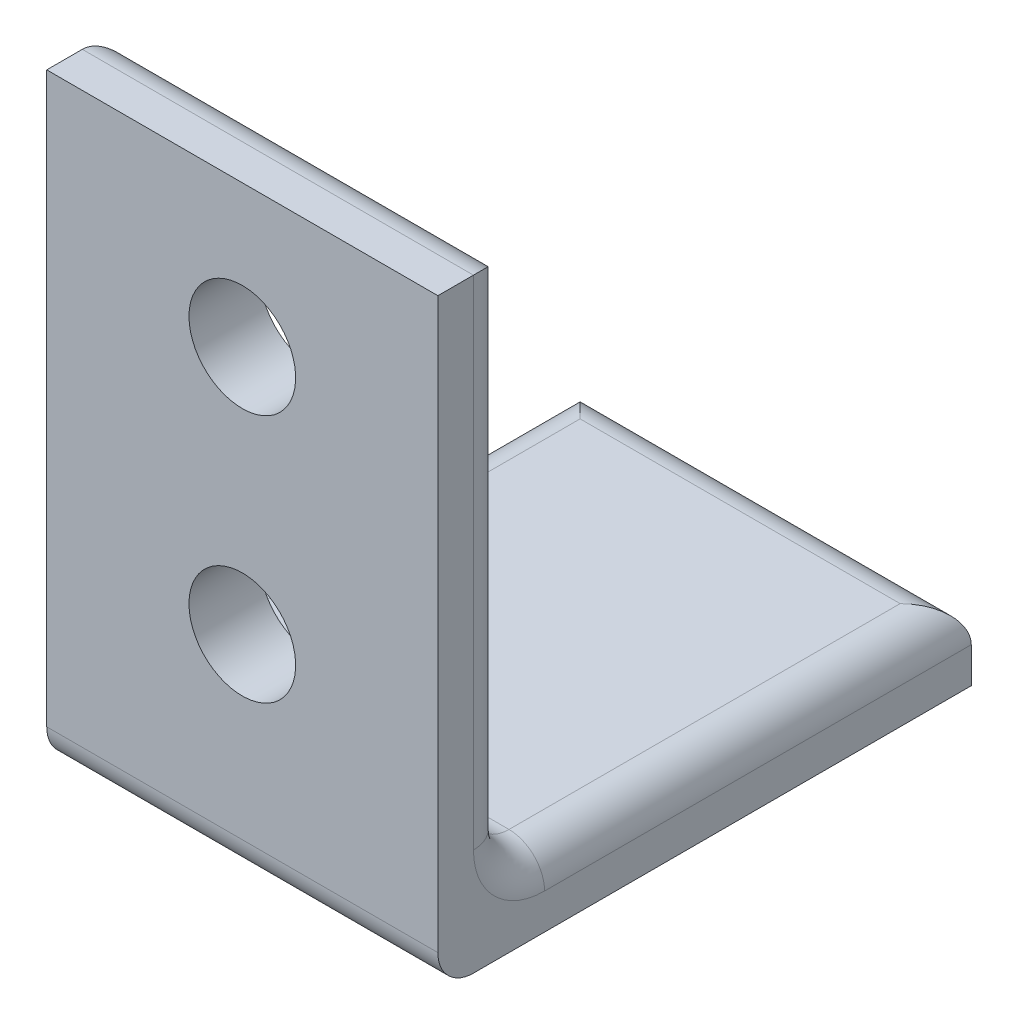
ISO-10303-21;
HEADER;
FILE_DESCRIPTION(('STEP AP214'),'2;1');
FILE_NAME('part.step','',(''),(''),'','','');
FILE_SCHEMA(('AUTOMOTIVE_DESIGN { 1 0 10303 214 1 1 1 1 }'));
ENDSEC;
DATA;
#1=APPLICATION_CONTEXT('core data for automotive mechanical design processes');
#2=APPLICATION_PROTOCOL_DEFINITION('international standard','automotive_design',2000,#1);
#3=PRODUCT_CONTEXT('',#1,'mechanical');
#4=PRODUCT('Part','Part','',(#3));
#5=PRODUCT_RELATED_PRODUCT_CATEGORY('part','',(#4));
#6=PRODUCT_DEFINITION_FORMATION('','',#4);
#7=PRODUCT_DEFINITION_CONTEXT('part definition',#1,'design');
#8=PRODUCT_DEFINITION('design','',#6,#7);
#9=PRODUCT_DEFINITION_SHAPE('','',#8);
#10=(LENGTH_UNIT() NAMED_UNIT(*) SI_UNIT(.MILLI.,.METRE.));
#11=(NAMED_UNIT(*) PLANE_ANGLE_UNIT() SI_UNIT($,.RADIAN.));
#12=(NAMED_UNIT(*) SI_UNIT($,.STERADIAN.) SOLID_ANGLE_UNIT());
#13=UNCERTAINTY_MEASURE_WITH_UNIT(LENGTH_MEASURE(1.E-05),#10,'distance_accuracy_value','');
#14=(GEOMETRIC_REPRESENTATION_CONTEXT(3) GLOBAL_UNCERTAINTY_ASSIGNED_CONTEXT((#13)) GLOBAL_UNIT_ASSIGNED_CONTEXT((#10,
#11,#12)) REPRESENTATION_CONTEXT('',''));
#15=CARTESIAN_POINT('',(0.,0.,0.));
#16=DIRECTION('',(0.,0.,1.));
#17=DIRECTION('',(1.,0.,0.));
#18=AXIS2_PLACEMENT_3D('',#15,#16,#17);
#19=CARTESIAN_POINT('',(0.,2.,0.));
#20=DIRECTION('',(0.,-1.,0.));
#21=DIRECTION('',(0.,0.,-1.));
#22=AXIS2_PLACEMENT_3D('',#19,#20,#21);
#23=PLANE('',#22);
#24=DIRECTION('',(-1.,0.,0.));
#25=VECTOR('',#24,1.);
#26=CARTESIAN_POINT('',(-20.4424150508756,2.,23.6245786874606));
#27=LINE('',#26,#25);
#28=CARTESIAN_POINT('',(-30.4424150508756,2.,23.6245786874606));
#29=VERTEX_POINT('',#28);
#30=CARTESIAN_POINT('',(-21.4424150508756,2.,23.6245786874606));
#31=VERTEX_POINT('',#30);
#32=EDGE_CURVE('E172',#29,#31,#27,.F.);
#33=ORIENTED_EDGE('',*,*,#32,.T.);
#34=DIRECTION('',(0.,0.,-1.));
#35=VECTOR('',#34,1.);
#36=CARTESIAN_POINT('',(-21.4424150508756,2.,0.));
#37=LINE('',#36,#35);
#38=CARTESIAN_POINT('',(-21.4424150508756,2.,12.6245786874606));
#39=VERTEX_POINT('',#38);
#40=EDGE_CURVE('E43',#31,#39,#37,.T.);
#41=ORIENTED_EDGE('',*,*,#40,.T.);
#42=DIRECTION('',(1.,0.,0.));
#43=VECTOR('',#42,1.);
#44=CARTESIAN_POINT('',(0.,2.,12.6245786874606));
#45=LINE('',#44,#43);
#46=CARTESIAN_POINT('',(-30.4424150508756,2.,12.6245786874606));
#47=VERTEX_POINT('',#46);
#48=EDGE_CURVE('E54',#39,#47,#45,.F.);
#49=ORIENTED_EDGE('',*,*,#48,.T.);
#50=DIRECTION('',(0.,0.,1.));
#51=VECTOR('',#50,1.);
#52=CARTESIAN_POINT('',(-30.4424150508756,2.,0.));
#53=LINE('',#52,#51);
#54=EDGE_CURVE('E199',#47,#29,#53,.T.);
#55=ORIENTED_EDGE('',*,*,#54,.T.);
#56=EDGE_LOOP('',(#33,#41,#49,#55));
#57=FACE_BOUND('',#56,.T.);
#58=ADVANCED_FACE('F34',(#57),#23,.F.);
#59=CARTESIAN_POINT('',(-31.4424150508756,2.,26.6245786874606));
#60=DIRECTION('',(1.,0.,0.));
#61=DIRECTION('',(0.,0.,-1.));
#62=AXIS2_PLACEMENT_3D('',#59,#60,#61);
#63=PLANE('',#62);
#64=DIRECTION('',(0.,0.,1.));
#65=VECTOR('',#64,1.);
#66=CARTESIAN_POINT('',(-31.4424150508756,17.,26.6245786874606));
#67=LINE('',#66,#65);
#68=CARTESIAN_POINT('',(-31.4424150508756,17.,25.6245786874606));
#69=VERTEX_POINT('',#68);
#70=CARTESIAN_POINT('',(-31.4424150508756,17.,26.6245786874606));
#71=VERTEX_POINT('',#70);
#72=EDGE_CURVE('E250',#69,#71,#67,.T.);
#73=ORIENTED_EDGE('',*,*,#72,.F.);
#74=DIRECTION('',(0.,-1.,0.));
#75=VECTOR('',#74,1.);
#76=CARTESIAN_POINT('',(-31.4424150508756,2.,25.6245786874606));
#77=LINE('',#76,#75);
#78=CARTESIAN_POINT('',(-31.4424150508756,3.,25.6245786874606));
#79=VERTEX_POINT('',#78);
#80=EDGE_CURVE('E195',#69,#79,#77,.T.);
#81=ORIENTED_EDGE('',*,*,#80,.T.);
#82=CARTESIAN_POINT('',(-31.4424150508756,3.,23.6245786874606));
#83=DIRECTION('',(1.,0.,0.));
#84=DIRECTION('',(0.,0.,-1.));
#85=AXIS2_PLACEMENT_3D('',#82,#83,#84);
#86=CIRCLE('',#85,2.);
#87=CARTESIAN_POINT('',(-31.4424150508756,1.,23.6245786874606));
#88=VERTEX_POINT('',#87);
#89=EDGE_CURVE('E193',#79,#88,#86,.T.);
#90=ORIENTED_EDGE('',*,*,#89,.T.);
#91=DIRECTION('',(0.,0.,1.));
#92=VECTOR('',#91,1.);
#93=CARTESIAN_POINT('',(-31.4424150508756,1.,26.6245786874606));
#94=LINE('',#93,#92);
#95=CARTESIAN_POINT('',(-31.4424150508756,0.999999999999999,11.6245786874606));
#96=VERTEX_POINT('',#95);
#97=EDGE_CURVE('E143',#88,#96,#94,.F.);
#98=ORIENTED_EDGE('',*,*,#97,.T.);
#99=DIRECTION('',(0.,1.,0.));
#100=VECTOR('',#99,1.);
#101=CARTESIAN_POINT('',(-31.4424150508756,-13.,11.6245786874606));
#102=LINE('',#101,#100);
#103=CARTESIAN_POINT('',(-31.4424150508756,0.,11.6245786874606));
#104=VERTEX_POINT('',#103);
#105=EDGE_CURVE('E126',#104,#96,#102,.T.);
#106=ORIENTED_EDGE('',*,*,#105,.F.);
#107=DIRECTION('',(0.,0.,1.));
#108=VECTOR('',#107,1.);
#109=CARTESIAN_POINT('',(-31.4424150508756,0.,26.6245786874606));
#110=LINE('',#109,#108);
#111=CARTESIAN_POINT('',(-31.4424150508756,0.,25.6245786874606));
#112=VERTEX_POINT('',#111);
#113=EDGE_CURVE('E140',#104,#112,#110,.T.);
#114=ORIENTED_EDGE('',*,*,#113,.T.);
#115=CARTESIAN_POINT('',(-31.4424150508756,1.,25.6245786874606));
#116=DIRECTION('',(1.,0.,0.));
#117=DIRECTION('',(0.,0.,-1.));
#118=AXIS2_PLACEMENT_3D('',#115,#116,#117);
#119=CIRCLE('',#118,1.);
#120=CARTESIAN_POINT('',(-31.4424150508756,1.,26.6245786874606));
#121=VERTEX_POINT('',#120);
#122=EDGE_CURVE('E167',#112,#121,#119,.F.);
#123=ORIENTED_EDGE('',*,*,#122,.T.);
#124=DIRECTION('',(0.,-1.,0.));
#125=VECTOR('',#124,1.);
#126=CARTESIAN_POINT('',(-31.4424150508756,2.,26.6245786874606));
#127=LINE('',#126,#125);
#128=EDGE_CURVE('E134',#71,#121,#127,.T.);
#129=ORIENTED_EDGE('',*,*,#128,.F.);
#130=EDGE_LOOP('',(#73,#81,#90,#98,#106,#114,#123,#129));
#131=FACE_BOUND('',#130,.T.);
#132=ADVANCED_FACE('F139',(#131),#63,.F.);
#133=CARTESIAN_POINT('',(-31.4424150508756,2.,26.6245786874606));
#134=DIRECTION('',(0.,0.,-1.));
#135=DIRECTION('',(-1.,0.,0.));
#136=AXIS2_PLACEMENT_3D('',#133,#134,#135);
#137=PLANE('',#136);
#138=CARTESIAN_POINT('',(-25.9424150508756,13.,26.6245786874606));
#139=DIRECTION('',(0.,0.,-1.));
#140=DIRECTION('',(-1.,0.,0.));
#141=AXIS2_PLACEMENT_3D('',#138,#139,#140);
#142=CIRCLE('',#141,1.5);
#143=CARTESIAN_POINT('',(-27.4424150508756,13.,26.6245786874606));
#144=VERTEX_POINT('',#143);
#145=EDGE_CURVE('E239',#144,#144,#142,.T.);
#146=ORIENTED_EDGE('',*,*,#145,.T.);
#147=EDGE_LOOP('',(#146));
#148=FACE_BOUND('',#147,.T.);
#149=CARTESIAN_POINT('',(-25.9424150508756,6.,26.6245786874606));
#150=DIRECTION('',(0.,0.,-1.));
#151=DIRECTION('',(-1.,0.,0.));
#152=AXIS2_PLACEMENT_3D('',#149,#150,#151);
#153=CIRCLE('',#152,1.5);
#154=CARTESIAN_POINT('',(-27.4424150508756,6.,26.6245786874606));
#155=VERTEX_POINT('',#154);
#156=EDGE_CURVE('E247',#155,#155,#153,.T.);
#157=ORIENTED_EDGE('',*,*,#156,.T.);
#158=EDGE_LOOP('',(#157));
#159=FACE_BOUND('',#158,.T.);
#160=ORIENTED_EDGE('',*,*,#128,.T.);
#161=DIRECTION('',(1.,0.,0.));
#162=VECTOR('',#161,1.);
#163=CARTESIAN_POINT('',(-20.4424150508756,1.,26.6245786874606));
#164=LINE('',#163,#162);
#165=CARTESIAN_POINT('',(-20.4424150508756,1.,26.6245786874606));
#166=VERTEX_POINT('',#165);
#167=EDGE_CURVE('E133',#121,#166,#164,.T.);
#168=ORIENTED_EDGE('',*,*,#167,.T.);
#169=DIRECTION('',(0.,-1.,0.));
#170=VECTOR('',#169,1.);
#171=CARTESIAN_POINT('',(-20.4424150508756,2.,26.6245786874606));
#172=LINE('',#171,#170);
#173=CARTESIAN_POINT('',(-20.4424150508756,17.,26.6245786874606));
#174=VERTEX_POINT('',#173);
#175=EDGE_CURVE('E151',#174,#166,#172,.T.);
#176=ORIENTED_EDGE('',*,*,#175,.F.);
#177=DIRECTION('',(1.,0.,0.));
#178=VECTOR('',#177,1.);
#179=CARTESIAN_POINT('',(-31.4424150508756,17.,26.6245786874606));
#180=LINE('',#179,#178);
#181=EDGE_CURVE('E154',#71,#174,#180,.T.);
#182=ORIENTED_EDGE('',*,*,#181,.F.);
#183=EDGE_LOOP('',(#160,#168,#176,#182));
#184=FACE_BOUND('',#183,.T.);
#185=ADVANCED_FACE('F295',(#148,#159,#184),#137,.F.);
#186=CARTESIAN_POINT('',(-20.4424150508756,2.,26.6245786874606));
#187=DIRECTION('',(-1.,0.,0.));
#188=DIRECTION('',(0.,0.,1.));
#189=AXIS2_PLACEMENT_3D('',#186,#187,#188);
#190=PLANE('',#189);
#191=CARTESIAN_POINT('',(-20.4424150508756,3.,23.6245786874606));
#192=DIRECTION('',(-1.,0.,0.));
#193=DIRECTION('',(0.,0.,1.));
#194=AXIS2_PLACEMENT_3D('',#191,#192,#193);
#195=CIRCLE('',#194,2.);
#196=CARTESIAN_POINT('',(-20.4424150508756,1.,23.6245786874606));
#197=VERTEX_POINT('',#196);
#198=CARTESIAN_POINT('',(-20.4424150508756,3.,25.6245786874606));
#199=VERTEX_POINT('',#198);
#200=EDGE_CURVE('E183',#197,#199,#195,.T.);
#201=ORIENTED_EDGE('',*,*,#200,.T.);
#202=DIRECTION('',(0.,-1.,0.));
#203=VECTOR('',#202,1.);
#204=CARTESIAN_POINT('',(-20.4424150508756,2.,25.6245786874606));
#205=LINE('',#204,#203);
#206=CARTESIAN_POINT('',(-20.4424150508756,17.,25.6245786874606));
#207=VERTEX_POINT('',#206);
#208=EDGE_CURVE('E185',#199,#207,#205,.F.);
#209=ORIENTED_EDGE('',*,*,#208,.T.);
#210=DIRECTION('',(0.,0.,-1.));
#211=VECTOR('',#210,1.);
#212=CARTESIAN_POINT('',(-20.4424150508756,17.,26.6245786874606));
#213=LINE('',#212,#211);
#214=EDGE_CURVE('E149',#174,#207,#213,.T.);
#215=ORIENTED_EDGE('',*,*,#214,.F.);
#216=ORIENTED_EDGE('',*,*,#175,.T.);
#217=CARTESIAN_POINT('',(-20.4424150508756,1.,25.6245786874606));
#218=DIRECTION('',(-1.,0.,0.));
#219=DIRECTION('',(0.,0.,1.));
#220=AXIS2_PLACEMENT_3D('',#217,#218,#219);
#221=CIRCLE('',#220,1.);
#222=CARTESIAN_POINT('',(-20.4424150508756,0.,25.6245786874606));
#223=VERTEX_POINT('',#222);
#224=EDGE_CURVE('E164',#166,#223,#221,.F.);
#225=ORIENTED_EDGE('',*,*,#224,.T.);
#226=DIRECTION('',(0.,0.,-1.));
#227=VECTOR('',#226,1.);
#228=CARTESIAN_POINT('',(-20.4424150508756,0.,26.6245786874606));
#229=LINE('',#228,#227);
#230=CARTESIAN_POINT('',(-20.4424150508756,0.,11.6245786874606));
#231=VERTEX_POINT('',#230);
#232=EDGE_CURVE('E148',#223,#231,#229,.T.);
#233=ORIENTED_EDGE('',*,*,#232,.T.);
#234=DIRECTION('',(0.,1.,0.));
#235=VECTOR('',#234,1.);
#236=CARTESIAN_POINT('',(-20.4424150508756,-13.,11.6245786874606));
#237=LINE('',#236,#235);
#238=CARTESIAN_POINT('',(-20.4424150508756,0.999999999999999,11.6245786874606));
#239=VERTEX_POINT('',#238);
#240=EDGE_CURVE('E129',#231,#239,#237,.T.);
#241=ORIENTED_EDGE('',*,*,#240,.T.);
#242=DIRECTION('',(0.,0.,-1.));
#243=VECTOR('',#242,1.);
#244=CARTESIAN_POINT('',(-20.4424150508756,1.,26.6245786874606));
#245=LINE('',#244,#243);
#246=EDGE_CURVE('E181',#239,#197,#245,.F.);
#247=ORIENTED_EDGE('',*,*,#246,.T.);
#248=EDGE_LOOP('',(#201,#209,#215,#216,#225,#233,#241,#247));
#249=FACE_BOUND('',#248,.T.);
#250=ADVANCED_FACE('F234',(#249),#190,.F.);
#251=CARTESIAN_POINT('',(0.,0.,0.));
#252=DIRECTION('',(0.,-1.,0.));
#253=DIRECTION('',(0.,0.,-1.));
#254=AXIS2_PLACEMENT_3D('',#251,#252,#253);
#255=PLANE('',#254);
#256=ORIENTED_EDGE('',*,*,#232,.F.);
#257=DIRECTION('',(1.,0.,0.));
#258=VECTOR('',#257,1.);
#259=CARTESIAN_POINT('',(-31.4424150508756,0.,25.6245786874606));
#260=LINE('',#259,#258);
#261=EDGE_CURVE('E147',#223,#112,#260,.F.);
#262=ORIENTED_EDGE('',*,*,#261,.T.);
#263=ORIENTED_EDGE('',*,*,#113,.F.);
#264=DIRECTION('',(-1.,0.,0.));
#265=VECTOR('',#264,1.);
#266=CARTESIAN_POINT('',(0.,0.,11.6245786874606));
#267=LINE('',#266,#265);
#268=EDGE_CURVE('E123',#231,#104,#267,.T.);
#269=ORIENTED_EDGE('',*,*,#268,.F.);
#270=EDGE_LOOP('',(#256,#262,#263,#269));
#271=FACE_BOUND('',#270,.T.);
#272=ADVANCED_FACE('F145',(#271),#255,.T.);
#273=CARTESIAN_POINT('',(-31.4424150508756,17.,24.6245786874606));
#274=DIRECTION('',(0.,0.,1.));
#275=DIRECTION('',(1.,0.,0.));
#276=AXIS2_PLACEMENT_3D('',#273,#274,#275);
#277=PLANE('',#276);
#278=CARTESIAN_POINT('',(-25.9424150508756,13.,24.6245786874606));
#279=DIRECTION('',(0.,0.,-1.));
#280=DIRECTION('',(-1.,0.,0.));
#281=AXIS2_PLACEMENT_3D('',#278,#279,#280);
#282=CIRCLE('',#281,1.5);
#283=CARTESIAN_POINT('',(-27.4424150508756,13.,24.6245786874606));
#284=VERTEX_POINT('',#283);
#285=EDGE_CURVE('E236',#284,#284,#282,.T.);
#286=ORIENTED_EDGE('',*,*,#285,.F.);
#287=EDGE_LOOP('',(#286));
#288=FACE_BOUND('',#287,.T.);
#289=CARTESIAN_POINT('',(-25.9424150508756,6.,24.6245786874606));
#290=DIRECTION('',(0.,0.,-1.));
#291=DIRECTION('',(-1.,0.,0.));
#292=AXIS2_PLACEMENT_3D('',#289,#290,#291);
#293=CIRCLE('',#292,1.5);
#294=CARTESIAN_POINT('',(-27.4424150508756,6.,24.6245786874606));
#295=VERTEX_POINT('',#294);
#296=EDGE_CURVE('E244',#295,#295,#293,.T.);
#297=ORIENTED_EDGE('',*,*,#296,.F.);
#298=EDGE_LOOP('',(#297));
#299=FACE_BOUND('',#298,.T.);
#300=DIRECTION('',(-1.,0.,0.));
#301=VECTOR('',#300,1.);
#302=CARTESIAN_POINT('',(-31.4424150508756,16.,24.6245786874606));
#303=LINE('',#302,#301);
#304=CARTESIAN_POINT('',(-30.4424150508756,16.,24.6245786874606));
#305=VERTEX_POINT('',#304);
#306=CARTESIAN_POINT('',(-21.4424150508756,16.,24.6245786874606));
#307=VERTEX_POINT('',#306);
#308=EDGE_CURVE('E174',#305,#307,#303,.F.);
#309=ORIENTED_EDGE('',*,*,#308,.T.);
#310=DIRECTION('',(0.,-1.,0.));
#311=VECTOR('',#310,1.);
#312=CARTESIAN_POINT('',(-21.4424150508756,17.,24.6245786874606));
#313=LINE('',#312,#311);
#314=CARTESIAN_POINT('',(-21.4424150508756,3.,24.6245786874606));
#315=VERTEX_POINT('',#314);
#316=EDGE_CURVE('E178',#307,#315,#313,.T.);
#317=ORIENTED_EDGE('',*,*,#316,.T.);
#318=DIRECTION('',(-1.,0.,0.));
#319=VECTOR('',#318,1.);
#320=CARTESIAN_POINT('',(-31.4424150508756,3.,24.6245786874606));
#321=LINE('',#320,#319);
#322=CARTESIAN_POINT('',(-30.4424150508756,3.,24.6245786874606));
#323=VERTEX_POINT('',#322);
#324=EDGE_CURVE('E169',#315,#323,#321,.T.);
#325=ORIENTED_EDGE('',*,*,#324,.T.);
#326=DIRECTION('',(0.,-1.,0.));
#327=VECTOR('',#326,1.);
#328=CARTESIAN_POINT('',(-30.4424150508756,17.,24.6245786874606));
#329=LINE('',#328,#327);
#330=EDGE_CURVE('E176',#323,#305,#329,.F.);
#331=ORIENTED_EDGE('',*,*,#330,.T.);
#332=EDGE_LOOP('',(#309,#317,#325,#331));
#333=FACE_BOUND('',#332,.T.);
#334=ADVANCED_FACE('F273',(#288,#299,#333),#277,.F.);
#335=CARTESIAN_POINT('',(0.,17.,0.));
#336=DIRECTION('',(0.,-1.,0.));
#337=DIRECTION('',(0.,0.,-1.));
#338=AXIS2_PLACEMENT_3D('',#335,#336,#337);
#339=PLANE('',#338);
#340=ORIENTED_EDGE('',*,*,#214,.T.);
#341=DIRECTION('',(-1.,0.,0.));
#342=VECTOR('',#341,1.);
#343=CARTESIAN_POINT('',(0.,17.,25.6245786874606));
#344=LINE('',#343,#342);
#345=EDGE_CURVE('E11',#207,#69,#344,.T.);
#346=ORIENTED_EDGE('',*,*,#345,.T.);
#347=ORIENTED_EDGE('',*,*,#72,.T.);
#348=ORIENTED_EDGE('',*,*,#181,.T.);
#349=EDGE_LOOP('',(#340,#346,#347,#348));
#350=FACE_BOUND('',#349,.T.);
#351=ADVANCED_FACE('F255',(#350),#339,.F.);
#352=CARTESIAN_POINT('',(-25.9424150508756,6.,39.6245786874606));
#353=DIRECTION('',(0.,0.,-1.));
#354=DIRECTION('',(-1.,0.,0.));
#355=AXIS2_PLACEMENT_3D('',#352,#353,#354);
#356=CYLINDRICAL_SURFACE('',#355,1.5);
#357=ORIENTED_EDGE('',*,*,#296,.T.);
#358=EDGE_LOOP('',(#357));
#359=FACE_BOUND('',#358,.T.);
#360=ORIENTED_EDGE('',*,*,#156,.F.);
#361=EDGE_LOOP('',(#360));
#362=FACE_BOUND('',#361,.T.);
#363=ADVANCED_FACE('F392',(#359,#362),#356,.F.);
#364=CARTESIAN_POINT('',(-25.9424150508756,13.,39.6245786874606));
#365=DIRECTION('',(0.,0.,-1.));
#366=DIRECTION('',(-1.,0.,0.));
#367=AXIS2_PLACEMENT_3D('',#364,#365,#366);
#368=CYLINDRICAL_SURFACE('',#367,1.5);
#369=ORIENTED_EDGE('',*,*,#285,.T.);
#370=EDGE_LOOP('',(#369));
#371=FACE_BOUND('',#370,.T.);
#372=ORIENTED_EDGE('',*,*,#145,.F.);
#373=EDGE_LOOP('',(#372));
#374=FACE_BOUND('',#373,.T.);
#375=ADVANCED_FACE('F383',(#371,#374),#368,.F.);
#376=CARTESIAN_POINT('',(-31.4424150508756,-13.,11.6245786874606));
#377=DIRECTION('',(0.,0.,1.));
#378=DIRECTION('',(1.,0.,0.));
#379=AXIS2_PLACEMENT_3D('',#376,#377,#378);
#380=PLANE('',#379);
#381=ORIENTED_EDGE('',*,*,#105,.T.);
#382=DIRECTION('',(1.,0.,0.));
#383=VECTOR('',#382,1.);
#384=CARTESIAN_POINT('',(-31.4424150508756,0.999999999999999,11.6245786874606));
#385=LINE('',#384,#383);
#386=EDGE_CURVE('E197',#96,#239,#385,.T.);
#387=ORIENTED_EDGE('',*,*,#386,.T.);
#388=ORIENTED_EDGE('',*,*,#240,.F.);
#389=ORIENTED_EDGE('',*,*,#268,.T.);
#390=EDGE_LOOP('',(#381,#387,#388,#389));
#391=FACE_BOUND('',#390,.T.);
#392=ADVANCED_FACE('F125',(#391),#380,.F.);
#393=CARTESIAN_POINT('',(-31.4424150508756,1.,25.6245786874606));
#394=DIRECTION('',(-1.,0.,0.));
#395=DIRECTION('',(0.,0.,1.));
#396=AXIS2_PLACEMENT_3D('',#393,#394,#395);
#397=CYLINDRICAL_SURFACE('',#396,1.);
#398=ORIENTED_EDGE('',*,*,#122,.F.);
#399=ORIENTED_EDGE('',*,*,#261,.F.);
#400=ORIENTED_EDGE('',*,*,#224,.F.);
#401=ORIENTED_EDGE('',*,*,#167,.F.);
#402=EDGE_LOOP('',(#398,#399,#400,#401));
#403=FACE_BOUND('',#402,.T.);
#404=ADVANCED_FACE('F307',(#403),#397,.T.);
#405=CARTESIAN_POINT('',(-31.4424150508756,3.,23.6245786874606));
#406=DIRECTION('',(1.,0.,0.));
#407=DIRECTION('',(0.,0.,-1.));
#408=AXIS2_PLACEMENT_3D('',#405,#406,#407);
#409=CYLINDRICAL_SURFACE('',#408,1.);
#410=ORIENTED_EDGE('',*,*,#324,.F.);
#411=CARTESIAN_POINT('',(-21.4424150508756,3.,23.6245786874606));
#412=DIRECTION('',(-1.,0.,0.));
#413=DIRECTION('',(0.,0.,1.));
#414=AXIS2_PLACEMENT_3D('',#411,#412,#413);
#415=CIRCLE('',#414,1.);
#416=EDGE_CURVE('E190',#315,#31,#415,.F.);
#417=ORIENTED_EDGE('',*,*,#416,.T.);
#418=ORIENTED_EDGE('',*,*,#32,.F.);
#419=CARTESIAN_POINT('',(-30.4424150508756,3.,23.6245786874606));
#420=DIRECTION('',(1.,0.,0.));
#421=DIRECTION('',(0.,0.,-1.));
#422=AXIS2_PLACEMENT_3D('',#419,#420,#421);
#423=CIRCLE('',#422,1.);
#424=EDGE_CURVE('E188',#29,#323,#423,.F.);
#425=ORIENTED_EDGE('',*,*,#424,.T.);
#426=EDGE_LOOP('',(#410,#417,#418,#425));
#427=FACE_BOUND('',#426,.T.);
#428=ADVANCED_FACE('F275',(#427),#409,.F.);
#429=CARTESIAN_POINT('',(-30.4424150508756,1.,0.));
#430=DIRECTION('',(0.,0.,1.));
#431=DIRECTION('',(1.,0.,0.));
#432=AXIS2_PLACEMENT_3D('',#429,#430,#431);
#433=CYLINDRICAL_SURFACE('',#432,1.);
#434=CARTESIAN_POINT('',(-30.4424150508756,1.,12.6245786874606));
#435=DIRECTION('',(-0.707106781186547,0.,0.707106781186547));
#436=DIRECTION('',(0.707106781186547,0.,0.707106781186547));
#437=AXIS2_PLACEMENT_3D('',#434,#435,#436);
#438=ELLIPSE('',#437,1.41421356237309,1.);
#439=EDGE_CURVE('E218',#96,#47,#438,.F.);
#440=ORIENTED_EDGE('',*,*,#439,.F.);
#441=ORIENTED_EDGE('',*,*,#97,.F.);
#442=CARTESIAN_POINT('',(-30.4424150508756,1.,23.6245786874606));
#443=DIRECTION('',(0.,0.,1.));
#444=DIRECTION('',(1.,0.,0.));
#445=AXIS2_PLACEMENT_3D('',#442,#443,#444);
#446=CIRCLE('',#445,1.);
#447=EDGE_CURVE('E38',#29,#88,#446,.T.);
#448=ORIENTED_EDGE('',*,*,#447,.F.);
#449=ORIENTED_EDGE('',*,*,#54,.F.);
#450=EDGE_LOOP('',(#440,#441,#448,#449));
#451=FACE_BOUND('',#450,.T.);
#452=ADVANCED_FACE('F36',(#451),#433,.T.);
#453=CARTESIAN_POINT('',(-30.4424150508756,3.,23.6245786874606));
#454=DIRECTION('',(1.,0.,0.));
#455=DIRECTION('',(0.,0.,-1.));
#456=AXIS2_PLACEMENT_3D('',#453,#454,#455);
#457=TOROIDAL_SURFACE('',#456,2.,1.);
#458=ORIENTED_EDGE('',*,*,#447,.T.);
#459=ORIENTED_EDGE('',*,*,#89,.F.);
#460=CARTESIAN_POINT('',(-30.4424150508756,3.,25.6245786874606));
#461=DIRECTION('',(0.,1.,0.));
#462=DIRECTION('',(0.,0.,1.));
#463=AXIS2_PLACEMENT_3D('',#460,#461,#462);
#464=CIRCLE('',#463,1.);
#465=EDGE_CURVE('E216',#323,#79,#464,.T.);
#466=ORIENTED_EDGE('',*,*,#465,.F.);
#467=ORIENTED_EDGE('',*,*,#424,.F.);
#468=EDGE_LOOP('',(#458,#459,#466,#467));
#469=FACE_BOUND('',#468,.T.);
#470=ADVANCED_FACE('F227',(#469),#457,.T.);
#471=CARTESIAN_POINT('',(-31.4424150508756,0.999999999999999,12.6245786874606));
#472=DIRECTION('',(1.,0.,0.));
#473=DIRECTION('',(0.,0.,-1.));
#474=AXIS2_PLACEMENT_3D('',#471,#472,#473);
#475=CYLINDRICAL_SURFACE('',#474,1.);
#476=ORIENTED_EDGE('',*,*,#439,.T.);
#477=ORIENTED_EDGE('',*,*,#48,.F.);
#478=CARTESIAN_POINT('',(-21.4424150508756,1.,12.6245786874606));
#479=DIRECTION('',(-0.707106781186547,0.,-0.707106781186547));
#480=DIRECTION('',(0.707106781186547,0.,-0.707106781186547));
#481=AXIS2_PLACEMENT_3D('',#478,#479,#480);
#482=ELLIPSE('',#481,1.41421356237309,1.);
#483=EDGE_CURVE('E213',#239,#39,#482,.F.);
#484=ORIENTED_EDGE('',*,*,#483,.F.);
#485=ORIENTED_EDGE('',*,*,#386,.F.);
#486=EDGE_LOOP('',(#476,#477,#484,#485));
#487=FACE_BOUND('',#486,.T.);
#488=ADVANCED_FACE('F231',(#487),#475,.T.);
#489=CARTESIAN_POINT('',(-30.4424150508756,2.,25.6245786874606));
#490=DIRECTION('',(0.,-1.,0.));
#491=DIRECTION('',(0.,0.,-1.));
#492=AXIS2_PLACEMENT_3D('',#489,#490,#491);
#493=CYLINDRICAL_SURFACE('',#492,1.);
#494=ORIENTED_EDGE('',*,*,#465,.T.);
#495=ORIENTED_EDGE('',*,*,#80,.F.);
#496=CARTESIAN_POINT('',(-30.4424150508756,16.,25.6245786874606));
#497=DIRECTION('',(-0.707106781186547,-0.707106781186547,0.));
#498=DIRECTION('',(-0.707106781186547,0.707106781186547,0.));
#499=AXIS2_PLACEMENT_3D('',#496,#497,#498);
#500=ELLIPSE('',#499,1.41421356237309,1.);
#501=EDGE_CURVE('E210',#305,#69,#500,.F.);
#502=ORIENTED_EDGE('',*,*,#501,.F.);
#503=ORIENTED_EDGE('',*,*,#330,.F.);
#504=EDGE_LOOP('',(#494,#495,#502,#503));
#505=FACE_BOUND('',#504,.T.);
#506=ADVANCED_FACE('F280',(#505),#493,.T.);
#507=CARTESIAN_POINT('',(-21.4424150508756,1.,0.));
#508=DIRECTION('',(0.,0.,-1.));
#509=DIRECTION('',(-1.,0.,0.));
#510=AXIS2_PLACEMENT_3D('',#507,#508,#509);
#511=CYLINDRICAL_SURFACE('',#510,1.);
#512=ORIENTED_EDGE('',*,*,#483,.T.);
#513=ORIENTED_EDGE('',*,*,#40,.F.);
#514=CARTESIAN_POINT('',(-21.4424150508756,1.,23.6245786874606));
#515=DIRECTION('',(0.,0.,1.));
#516=DIRECTION('',(1.,0.,0.));
#517=AXIS2_PLACEMENT_3D('',#514,#515,#516);
#518=CIRCLE('',#517,1.);
#519=EDGE_CURVE('E207',#197,#31,#518,.T.);
#520=ORIENTED_EDGE('',*,*,#519,.F.);
#521=ORIENTED_EDGE('',*,*,#246,.F.);
#522=EDGE_LOOP('',(#512,#513,#520,#521));
#523=FACE_BOUND('',#522,.T.);
#524=ADVANCED_FACE('F277',(#523),#511,.T.);
#525=CARTESIAN_POINT('',(0.,16.,25.6245786874606));
#526=DIRECTION('',(-1.,0.,0.));
#527=DIRECTION('',(0.,0.,1.));
#528=AXIS2_PLACEMENT_3D('',#525,#526,#527);
#529=CYLINDRICAL_SURFACE('',#528,1.);
#530=ORIENTED_EDGE('',*,*,#501,.T.);
#531=ORIENTED_EDGE('',*,*,#345,.F.);
#532=CARTESIAN_POINT('',(-21.4424150508756,16.,25.6245786874606));
#533=DIRECTION('',(-0.707106781186547,0.707106781186547,0.));
#534=DIRECTION('',(-0.707106781186547,-0.707106781186547,0.));
#535=AXIS2_PLACEMENT_3D('',#532,#533,#534);
#536=ELLIPSE('',#535,1.41421356237309,1.);
#537=EDGE_CURVE('E205',#307,#207,#536,.F.);
#538=ORIENTED_EDGE('',*,*,#537,.F.);
#539=ORIENTED_EDGE('',*,*,#308,.F.);
#540=EDGE_LOOP('',(#530,#531,#538,#539));
#541=FACE_BOUND('',#540,.T.);
#542=ADVANCED_FACE('F279',(#541),#529,.T.);
#543=CARTESIAN_POINT('',(-21.4424150508756,3.,23.6245786874606));
#544=DIRECTION('',(-1.,0.,0.));
#545=DIRECTION('',(0.,0.,1.));
#546=AXIS2_PLACEMENT_3D('',#543,#544,#545);
#547=TOROIDAL_SURFACE('',#546,2.,1.);
#548=ORIENTED_EDGE('',*,*,#519,.T.);
#549=ORIENTED_EDGE('',*,*,#416,.F.);
#550=CARTESIAN_POINT('',(-21.4424150508756,3.,25.6245786874606));
#551=DIRECTION('',(0.,1.,0.));
#552=DIRECTION('',(0.,0.,1.));
#553=AXIS2_PLACEMENT_3D('',#550,#551,#552);
#554=CIRCLE('',#553,1.);
#555=EDGE_CURVE('E203',#199,#315,#554,.T.);
#556=ORIENTED_EDGE('',*,*,#555,.F.);
#557=ORIENTED_EDGE('',*,*,#200,.F.);
#558=EDGE_LOOP('',(#548,#549,#556,#557));
#559=FACE_BOUND('',#558,.T.);
#560=ADVANCED_FACE('F268',(#559),#547,.T.);
#561=CARTESIAN_POINT('',(-21.4424150508756,17.,25.6245786874606));
#562=DIRECTION('',(0.,-1.,0.));
#563=DIRECTION('',(0.,0.,-1.));
#564=AXIS2_PLACEMENT_3D('',#561,#562,#563);
#565=CYLINDRICAL_SURFACE('',#564,1.);
#566=ORIENTED_EDGE('',*,*,#537,.T.);
#567=ORIENTED_EDGE('',*,*,#208,.F.);
#568=ORIENTED_EDGE('',*,*,#555,.T.);
#569=ORIENTED_EDGE('',*,*,#316,.F.);
#570=EDGE_LOOP('',(#566,#567,#568,#569));
#571=FACE_BOUND('',#570,.T.);
#572=ADVANCED_FACE('F262',(#571),#565,.T.);
#573=CLOSED_SHELL('',(#58,#132,#185,#250,#272,#334,#351,#363,#375,#392,#404,#428,#452,#470,#488,
#506,#524,#542,#560,#572));
#574=MANIFOLD_SOLID_BREP('B2',#573);
#575=ADVANCED_BREP_SHAPE_REPRESENTATION('',(#18,#574),#14);
#576=SHAPE_DEFINITION_REPRESENTATION(#9,#575);
ENDSEC;
END-ISO-10303-21;
